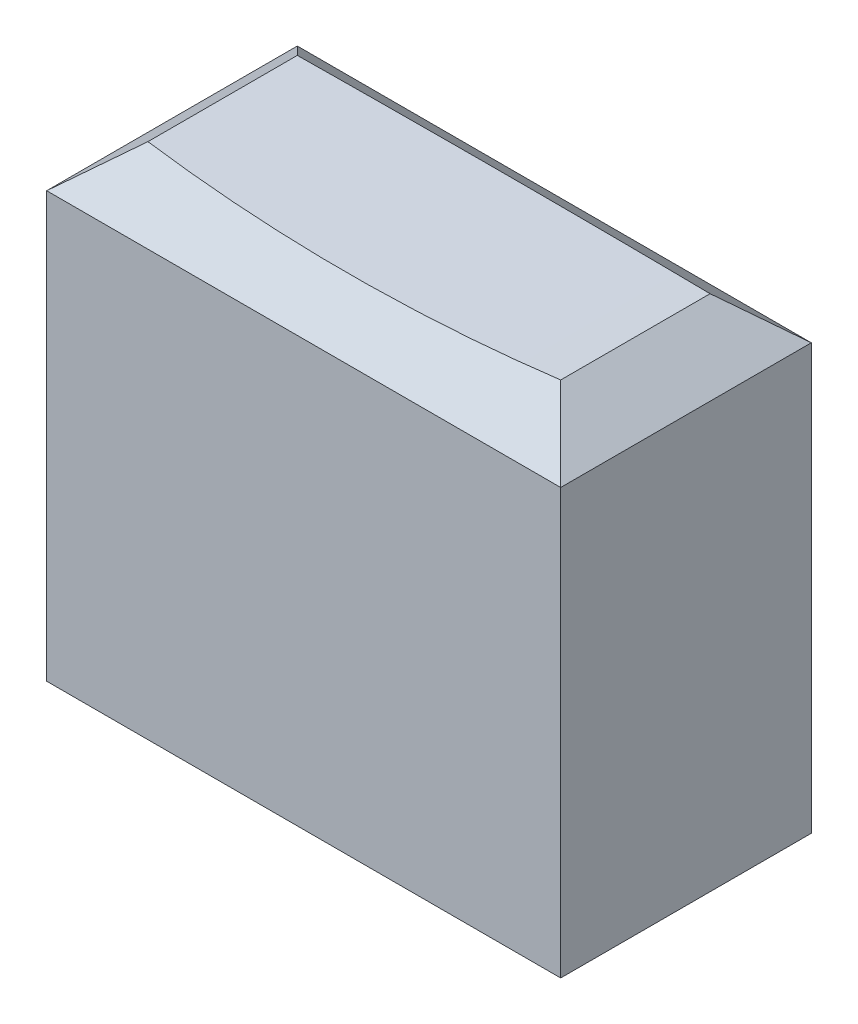
ISO-10303-21;
HEADER;
FILE_DESCRIPTION(('STEP AP214'),'2;1');
FILE_NAME('part.step','',(''),(''),'','','');
FILE_SCHEMA(('AUTOMOTIVE_DESIGN { 1 0 10303 214 1 1 1 1 }'));
ENDSEC;
DATA;
#1=APPLICATION_CONTEXT('core data for automotive mechanical design processes');
#2=APPLICATION_PROTOCOL_DEFINITION('international standard','automotive_design',2000,#1);
#3=PRODUCT_CONTEXT('',#1,'mechanical');
#4=PRODUCT('Part','Part','',(#3));
#5=PRODUCT_RELATED_PRODUCT_CATEGORY('part','',(#4));
#6=PRODUCT_DEFINITION_FORMATION('','',#4);
#7=PRODUCT_DEFINITION_CONTEXT('part definition',#1,'design');
#8=PRODUCT_DEFINITION('design','',#6,#7);
#9=PRODUCT_DEFINITION_SHAPE('','',#8);
#10=(LENGTH_UNIT() NAMED_UNIT(*) SI_UNIT(.MILLI.,.METRE.));
#11=(NAMED_UNIT(*) PLANE_ANGLE_UNIT() SI_UNIT($,.RADIAN.));
#12=(NAMED_UNIT(*) SI_UNIT($,.STERADIAN.) SOLID_ANGLE_UNIT());
#13=UNCERTAINTY_MEASURE_WITH_UNIT(LENGTH_MEASURE(1.E-05),#10,'distance_accuracy_value','');
#14=(GEOMETRIC_REPRESENTATION_CONTEXT(3) GLOBAL_UNCERTAINTY_ASSIGNED_CONTEXT((#13)) GLOBAL_UNIT_ASSIGNED_CONTEXT((#10,
#11,#12)) REPRESENTATION_CONTEXT('',''));
#15=CARTESIAN_POINT('',(0.,0.,0.));
#16=DIRECTION('',(0.,0.,1.));
#17=DIRECTION('',(1.,0.,0.));
#18=AXIS2_PLACEMENT_3D('',#15,#16,#17);
#19=CARTESIAN_POINT('',(-6.05,11.,-2.95));
#20=DIRECTION('',(1.,0.,0.));
#21=DIRECTION('',(0.,0.,-1.));
#22=AXIS2_PLACEMENT_3D('',#19,#20,#21);
#23=PLANE('',#22);
#24=DIRECTION('',(0.,-1.,0.));
#25=VECTOR('',#24,1.);
#26=CARTESIAN_POINT('',(-6.05,11.,2.95));
#27=LINE('',#26,#25);
#28=CARTESIAN_POINT('',(-6.05,10.,2.95));
#29=VERTEX_POINT('',#28);
#30=CARTESIAN_POINT('',(-6.05,0.,2.95));
#31=VERTEX_POINT('',#30);
#32=EDGE_CURVE('E393',#29,#31,#27,.T.);
#33=ORIENTED_EDGE('',*,*,#32,.F.);
#34=DIRECTION('',(0.,0.,-1.));
#35=VECTOR('',#34,1.);
#36=CARTESIAN_POINT('',(-6.05,10.,-2.95));
#37=LINE('',#36,#35);
#38=CARTESIAN_POINT('',(-6.05,10.,-2.95));
#39=VERTEX_POINT('',#38);
#40=EDGE_CURVE('E40',#29,#39,#37,.T.);
#41=ORIENTED_EDGE('',*,*,#40,.T.);
#42=DIRECTION('',(0.,-1.,0.));
#43=VECTOR('',#42,1.);
#44=CARTESIAN_POINT('',(-6.05,11.,-2.95));
#45=LINE('',#44,#43);
#46=CARTESIAN_POINT('',(-6.05,0.,-2.95));
#47=VERTEX_POINT('',#46);
#48=EDGE_CURVE('E387',#39,#47,#45,.T.);
#49=ORIENTED_EDGE('',*,*,#48,.T.);
#50=DIRECTION('',(0.,0.,1.));
#51=VECTOR('',#50,1.);
#52=CARTESIAN_POINT('',(-6.05,0.,-2.95));
#53=LINE('',#52,#51);
#54=EDGE_CURVE('E374',#47,#31,#53,.T.);
#55=ORIENTED_EDGE('',*,*,#54,.T.);
#56=EDGE_LOOP('',(#33,#41,#49,#55));
#57=FACE_BOUND('',#56,.T.);
#58=ADVANCED_FACE('F32',(#57),#23,.F.);
#59=CARTESIAN_POINT('',(-6.05,11.,2.95));
#60=DIRECTION('',(0.,0.,-1.));
#61=DIRECTION('',(-1.,0.,0.));
#62=AXIS2_PLACEMENT_3D('',#59,#60,#61);
#63=PLANE('',#62);
#64=DIRECTION('',(0.,-1.,0.));
#65=VECTOR('',#64,1.);
#66=CARTESIAN_POINT('',(6.05,11.,2.95));
#67=LINE('',#66,#65);
#68=CARTESIAN_POINT('',(6.05,10.,2.95));
#69=VERTEX_POINT('',#68);
#70=CARTESIAN_POINT('',(6.05,0.,2.95));
#71=VERTEX_POINT('',#70);
#72=EDGE_CURVE('E391',#69,#71,#67,.T.);
#73=ORIENTED_EDGE('',*,*,#72,.F.);
#74=DIRECTION('',(-1.,0.,0.));
#75=VECTOR('',#74,1.);
#76=CARTESIAN_POINT('',(-6.05,10.,2.95));
#77=LINE('',#76,#75);
#78=EDGE_CURVE('E55',#69,#29,#77,.T.);
#79=ORIENTED_EDGE('',*,*,#78,.T.);
#80=ORIENTED_EDGE('',*,*,#32,.T.);
#81=DIRECTION('',(1.,0.,0.));
#82=VECTOR('',#81,1.);
#83=CARTESIAN_POINT('',(-6.05,0.,2.95));
#84=LINE('',#83,#82);
#85=EDGE_CURVE('E377',#31,#71,#84,.T.);
#86=ORIENTED_EDGE('',*,*,#85,.T.);
#87=EDGE_LOOP('',(#73,#79,#80,#86));
#88=FACE_BOUND('',#87,.T.);
#89=ADVANCED_FACE('F451',(#88),#63,.F.);
#90=CARTESIAN_POINT('',(6.05,11.,-2.95));
#91=DIRECTION('',(-1.,0.,0.));
#92=DIRECTION('',(0.,0.,1.));
#93=AXIS2_PLACEMENT_3D('',#90,#91,#92);
#94=PLANE('',#93);
#95=DIRECTION('',(0.,-1.,0.));
#96=VECTOR('',#95,1.);
#97=CARTESIAN_POINT('',(6.05,11.,-2.95));
#98=LINE('',#97,#96);
#99=CARTESIAN_POINT('',(6.05,10.,-2.95));
#100=VERTEX_POINT('',#99);
#101=CARTESIAN_POINT('',(6.05,0.,-2.95));
#102=VERTEX_POINT('',#101);
#103=EDGE_CURVE('E389',#100,#102,#98,.T.);
#104=ORIENTED_EDGE('',*,*,#103,.F.);
#105=DIRECTION('',(0.,0.,1.));
#106=VECTOR('',#105,1.);
#107=CARTESIAN_POINT('',(6.05,10.,2.95));
#108=LINE('',#107,#106);
#109=EDGE_CURVE('E402',#100,#69,#108,.T.);
#110=ORIENTED_EDGE('',*,*,#109,.T.);
#111=ORIENTED_EDGE('',*,*,#72,.T.);
#112=DIRECTION('',(0.,0.,-1.));
#113=VECTOR('',#112,1.);
#114=CARTESIAN_POINT('',(6.05,0.,-2.95));
#115=LINE('',#114,#113);
#116=EDGE_CURVE('E381',#71,#102,#115,.T.);
#117=ORIENTED_EDGE('',*,*,#116,.T.);
#118=EDGE_LOOP('',(#104,#110,#111,#117));
#119=FACE_BOUND('',#118,.T.);
#120=ADVANCED_FACE('F456',(#119),#94,.F.);
#121=CARTESIAN_POINT('',(-6.05,11.,-2.95));
#122=DIRECTION('',(0.,0.,1.));
#123=DIRECTION('',(1.,0.,0.));
#124=AXIS2_PLACEMENT_3D('',#121,#122,#123);
#125=PLANE('',#124);
#126=ORIENTED_EDGE('',*,*,#48,.F.);
#127=DIRECTION('',(1.,0.,0.));
#128=VECTOR('',#127,1.);
#129=CARTESIAN_POINT('',(6.05,10.,-2.95));
#130=LINE('',#129,#128);
#131=EDGE_CURVE('E399',#39,#100,#130,.T.);
#132=ORIENTED_EDGE('',*,*,#131,.T.);
#133=ORIENTED_EDGE('',*,*,#103,.T.);
#134=DIRECTION('',(-1.,0.,0.));
#135=VECTOR('',#134,1.);
#136=CARTESIAN_POINT('',(-6.05,0.,-2.95));
#137=LINE('',#136,#135);
#138=EDGE_CURVE('E384',#102,#47,#137,.T.);
#139=ORIENTED_EDGE('',*,*,#138,.T.);
#140=EDGE_LOOP('',(#126,#132,#133,#139));
#141=FACE_BOUND('',#140,.T.);
#142=ADVANCED_FACE('F431',(#141),#125,.F.);
#143=CARTESIAN_POINT('',(0.,0.,0.));
#144=DIRECTION('',(0.,1.,0.));
#145=DIRECTION('',(0.,0.,1.));
#146=AXIS2_PLACEMENT_3D('',#143,#144,#145);
#147=PLANE('',#146);
#148=DIRECTION('',(1.,0.,0.));
#149=VECTOR('',#148,1.);
#150=CARTESIAN_POINT('',(-5.55,0.,-2.45));
#151=LINE('',#150,#149);
#152=CARTESIAN_POINT('',(-5.55,0.,-2.45));
#153=VERTEX_POINT('',#152);
#154=CARTESIAN_POINT('',(-2.05,0.,-2.45));
#155=VERTEX_POINT('',#154);
#156=EDGE_CURVE('E282',#153,#155,#151,.T.);
#157=ORIENTED_EDGE('',*,*,#156,.F.);
#158=DIRECTION('',(0.,0.,-1.));
#159=VECTOR('',#158,1.);
#160=CARTESIAN_POINT('',(-5.55,0.,2.45));
#161=LINE('',#160,#159);
#162=CARTESIAN_POINT('',(-5.55,0.,2.45));
#163=VERTEX_POINT('',#162);
#164=EDGE_CURVE('E47',#163,#153,#161,.T.);
#165=ORIENTED_EDGE('',*,*,#164,.F.);
#166=DIRECTION('',(-1.,0.,0.));
#167=VECTOR('',#166,1.);
#168=CARTESIAN_POINT('',(-5.55,0.,2.45));
#169=LINE('',#168,#167);
#170=CARTESIAN_POINT('',(-2.05,0.,2.45));
#171=VERTEX_POINT('',#170);
#172=EDGE_CURVE('E226',#171,#163,#169,.T.);
#173=ORIENTED_EDGE('',*,*,#172,.F.);
#174=DIRECTION('',(0.,0.,1.));
#175=VECTOR('',#174,1.);
#176=CARTESIAN_POINT('',(-2.05,0.,2.45));
#177=LINE('',#176,#175);
#178=CARTESIAN_POINT('',(-2.05,0.,1.));
#179=VERTEX_POINT('',#178);
#180=EDGE_CURVE('E229',#179,#171,#177,.T.);
#181=ORIENTED_EDGE('',*,*,#180,.F.);
#182=DIRECTION('',(-1.,0.,0.));
#183=VECTOR('',#182,1.);
#184=CARTESIAN_POINT('',(-2.05,0.,1.));
#185=LINE('',#184,#183);
#186=CARTESIAN_POINT('',(-1.65,0.,1.));
#187=VERTEX_POINT('',#186);
#188=EDGE_CURVE('E329',#187,#179,#185,.T.);
#189=ORIENTED_EDGE('',*,*,#188,.F.);
#190=DIRECTION('',(0.,0.,-1.));
#191=VECTOR('',#190,1.);
#192=CARTESIAN_POINT('',(-1.65,0.,1.65));
#193=LINE('',#192,#191);
#194=CARTESIAN_POINT('',(-1.65,0.,1.65));
#195=VERTEX_POINT('',#194);
#196=EDGE_CURVE('E326',#195,#187,#193,.T.);
#197=ORIENTED_EDGE('',*,*,#196,.F.);
#198=DIRECTION('',(-1.,0.,0.));
#199=VECTOR('',#198,1.);
#200=CARTESIAN_POINT('',(-1.65,0.,1.65));
#201=LINE('',#200,#199);
#202=CARTESIAN_POINT('',(1.65,0.,1.65));
#203=VERTEX_POINT('',#202);
#204=EDGE_CURVE('E323',#203,#195,#201,.T.);
#205=ORIENTED_EDGE('',*,*,#204,.F.);
#206=DIRECTION('',(0.,0.,1.));
#207=VECTOR('',#206,1.);
#208=CARTESIAN_POINT('',(1.65,0.,1.65));
#209=LINE('',#208,#207);
#210=CARTESIAN_POINT('',(1.65,0.,1.));
#211=VERTEX_POINT('',#210);
#212=EDGE_CURVE('E320',#211,#203,#209,.T.);
#213=ORIENTED_EDGE('',*,*,#212,.F.);
#214=DIRECTION('',(-1.,0.,0.));
#215=VECTOR('',#214,1.);
#216=CARTESIAN_POINT('',(1.65,0.,1.));
#217=LINE('',#216,#215);
#218=CARTESIAN_POINT('',(2.05,0.,1.));
#219=VERTEX_POINT('',#218);
#220=EDGE_CURVE('E317',#219,#211,#217,.T.);
#221=ORIENTED_EDGE('',*,*,#220,.F.);
#222=DIRECTION('',(0.,0.,-1.));
#223=VECTOR('',#222,1.);
#224=CARTESIAN_POINT('',(2.05,0.,2.45));
#225=LINE('',#224,#223);
#226=CARTESIAN_POINT('',(2.05,0.,2.45));
#227=VERTEX_POINT('',#226);
#228=EDGE_CURVE('E314',#227,#219,#225,.T.);
#229=ORIENTED_EDGE('',*,*,#228,.F.);
#230=DIRECTION('',(-1.,0.,0.));
#231=VECTOR('',#230,1.);
#232=CARTESIAN_POINT('',(2.05,0.,2.45));
#233=LINE('',#232,#231);
#234=CARTESIAN_POINT('',(5.55,0.,2.45));
#235=VERTEX_POINT('',#234);
#236=EDGE_CURVE('E311',#235,#227,#233,.T.);
#237=ORIENTED_EDGE('',*,*,#236,.F.);
#238=DIRECTION('',(0.,0.,1.));
#239=VECTOR('',#238,1.);
#240=CARTESIAN_POINT('',(5.55,0.,2.45));
#241=LINE('',#240,#239);
#242=CARTESIAN_POINT('',(5.55,0.,-2.45));
#243=VERTEX_POINT('',#242);
#244=EDGE_CURVE('E308',#243,#235,#241,.T.);
#245=ORIENTED_EDGE('',*,*,#244,.F.);
#246=DIRECTION('',(1.,0.,0.));
#247=VECTOR('',#246,1.);
#248=CARTESIAN_POINT('',(2.05,0.,-2.45));
#249=LINE('',#248,#247);
#250=CARTESIAN_POINT('',(2.05,0.,-2.45));
#251=VERTEX_POINT('',#250);
#252=EDGE_CURVE('E305',#251,#243,#249,.T.);
#253=ORIENTED_EDGE('',*,*,#252,.F.);
#254=DIRECTION('',(0.,0.,-1.));
#255=VECTOR('',#254,1.);
#256=CARTESIAN_POINT('',(2.05,0.,-1.));
#257=LINE('',#256,#255);
#258=CARTESIAN_POINT('',(2.05,0.,-1.));
#259=VERTEX_POINT('',#258);
#260=EDGE_CURVE('E302',#259,#251,#257,.T.);
#261=ORIENTED_EDGE('',*,*,#260,.F.);
#262=DIRECTION('',(1.,0.,0.));
#263=VECTOR('',#262,1.);
#264=CARTESIAN_POINT('',(1.65,0.,-1.));
#265=LINE('',#264,#263);
#266=CARTESIAN_POINT('',(1.65,0.,-1.));
#267=VERTEX_POINT('',#266);
#268=EDGE_CURVE('E299',#267,#259,#265,.T.);
#269=ORIENTED_EDGE('',*,*,#268,.F.);
#270=DIRECTION('',(0.,0.,1.));
#271=VECTOR('',#270,1.);
#272=CARTESIAN_POINT('',(1.65,0.,-1.));
#273=LINE('',#272,#271);
#274=CARTESIAN_POINT('',(1.65,0.,-1.65));
#275=VERTEX_POINT('',#274);
#276=EDGE_CURVE('E296',#275,#267,#273,.T.);
#277=ORIENTED_EDGE('',*,*,#276,.F.);
#278=DIRECTION('',(1.,0.,0.));
#279=VECTOR('',#278,1.);
#280=CARTESIAN_POINT('',(-1.65,0.,-1.65));
#281=LINE('',#280,#279);
#282=CARTESIAN_POINT('',(-1.65,0.,-1.65));
#283=VERTEX_POINT('',#282);
#284=EDGE_CURVE('E293',#283,#275,#281,.T.);
#285=ORIENTED_EDGE('',*,*,#284,.F.);
#286=DIRECTION('',(0.,0.,-1.));
#287=VECTOR('',#286,1.);
#288=CARTESIAN_POINT('',(-1.65,0.,-1.));
#289=LINE('',#288,#287);
#290=CARTESIAN_POINT('',(-1.65,0.,-1.));
#291=VERTEX_POINT('',#290);
#292=EDGE_CURVE('E290',#291,#283,#289,.T.);
#293=ORIENTED_EDGE('',*,*,#292,.F.);
#294=DIRECTION('',(1.,0.,0.));
#295=VECTOR('',#294,1.);
#296=CARTESIAN_POINT('',(-2.05,0.,-1.));
#297=LINE('',#296,#295);
#298=CARTESIAN_POINT('',(-2.05,0.,-1.));
#299=VERTEX_POINT('',#298);
#300=EDGE_CURVE('E287',#299,#291,#297,.T.);
#301=ORIENTED_EDGE('',*,*,#300,.F.);
#302=DIRECTION('',(0.,0.,1.));
#303=VECTOR('',#302,1.);
#304=CARTESIAN_POINT('',(-2.05,0.,-1.));
#305=LINE('',#304,#303);
#306=EDGE_CURVE('E284',#155,#299,#305,.T.);
#307=ORIENTED_EDGE('',*,*,#306,.F.);
#308=EDGE_LOOP('',(#157,#165,#173,#181,#189,#197,#205,#213,#221,#229,#237,#245,#253,#261,#269,
#277,#285,#293,#301,#307));
#309=FACE_BOUND('',#308,.T.);
#310=ORIENTED_EDGE('',*,*,#54,.F.);
#311=ORIENTED_EDGE('',*,*,#138,.F.);
#312=ORIENTED_EDGE('',*,*,#116,.F.);
#313=ORIENTED_EDGE('',*,*,#85,.F.);
#314=EDGE_LOOP('',(#310,#311,#312,#313));
#315=FACE_BOUND('',#314,.T.);
#316=ADVANCED_FACE('F465',(#309,#315),#147,.F.);
#317=CARTESIAN_POINT('',(0.,11.,1.75824640740579));
#318=DIRECTION('',(0.,0.766044443118976,0.642787609686541));
#319=DIRECTION('',(-1.,0.,0.));
#320=AXIS2_PLACEMENT_3D('',#317,#318,#319);
#321=PLANE('',#320);
#322=CARTESIAN_POINT('',(0.,89.6001938502372,-91.9138169922152));
#323=DIRECTION('',(0.,0.766044443118976,0.642787609686541));
#324=DIRECTION('',(0.,-0.642787609686541,0.766044443118976));
#325=AXIS2_PLACEMENT_3D('',#322,#323,#324);
#326=ELLIPSE('',#325,122.51355294269,78.7501938502372);
#327=CARTESIAN_POINT('',(-4.85824640740579,11.,1.7582464074058));
#328=VERTEX_POINT('',#327);
#329=CARTESIAN_POINT('',(4.85824640740579,11.,1.7582464074058));
#330=VERTEX_POINT('',#329);
#331=EDGE_CURVE('E336',#328,#330,#326,.T.);
#332=ORIENTED_EDGE('',*,*,#331,.F.);
#333=DIRECTION('',(0.608120402411342,0.510273605374739,-0.608120402411342));
#334=VECTOR('',#333,1.);
#335=CARTESIAN_POINT('',(-4.20802855828736,11.5455975573802,1.10802855828736));
#336=LINE('',#335,#334);
#337=EDGE_CURVE('E410',#29,#328,#336,.T.);
#338=ORIENTED_EDGE('',*,*,#337,.F.);
#339=ORIENTED_EDGE('',*,*,#78,.F.);
#340=DIRECTION('',(-0.608120402411342,0.510273605374739,-0.608120402411342));
#341=VECTOR('',#340,1.);
#342=CARTESIAN_POINT('',(3.06161624441767,12.5075517071253,-0.038383755582331));
#343=LINE('',#342,#341);
#344=EDGE_CURVE('E378',#330,#69,#343,.F.);
#345=ORIENTED_EDGE('',*,*,#344,.F.);
#346=EDGE_LOOP('',(#332,#338,#339,#345));
#347=FACE_BOUND('',#346,.T.);
#348=ADVANCED_FACE('F34',(#347),#321,.T.);
#349=CARTESIAN_POINT('',(4.85824640740579,11.,0.));
#350=DIRECTION('',(0.642787609686541,0.766044443118976,0.));
#351=DIRECTION('',(0.,0.,1.));
#352=AXIS2_PLACEMENT_3D('',#349,#350,#351);
#353=PLANE('',#352);
#354=ORIENTED_EDGE('',*,*,#344,.T.);
#355=ORIENTED_EDGE('',*,*,#109,.F.);
#356=DIRECTION('',(-0.608120402411342,0.510273605374739,0.608120402411342));
#357=VECTOR('',#356,1.);
#358=CARTESIAN_POINT('',(4.20802855828736,11.5455975573802,-1.10802855828736));
#359=LINE('',#358,#357);
#360=CARTESIAN_POINT('',(4.85824640740579,11.,-1.75824640740579));
#361=VERTEX_POINT('',#360);
#362=EDGE_CURVE('E408',#361,#100,#359,.F.);
#363=ORIENTED_EDGE('',*,*,#362,.F.);
#364=DIRECTION('',(0.,0.,-1.));
#365=VECTOR('',#364,1.);
#366=CARTESIAN_POINT('',(4.85824640740579,11.,-2.95));
#367=LINE('',#366,#365);
#368=EDGE_CURVE('E397',#330,#361,#367,.T.);
#369=ORIENTED_EDGE('',*,*,#368,.F.);
#370=EDGE_LOOP('',(#354,#355,#363,#369));
#371=FACE_BOUND('',#370,.T.);
#372=ADVANCED_FACE('F417',(#371),#353,.T.);
#373=CARTESIAN_POINT('',(-4.85824640740579,11.,0.));
#374=DIRECTION('',(-0.642787609686541,0.766044443118976,0.));
#375=DIRECTION('',(0.,0.,-1.));
#376=AXIS2_PLACEMENT_3D('',#373,#374,#375);
#377=PLANE('',#376);
#378=ORIENTED_EDGE('',*,*,#337,.T.);
#379=DIRECTION('',(0.,0.,1.));
#380=VECTOR('',#379,1.);
#381=CARTESIAN_POINT('',(-4.85824640740579,11.,2.95));
#382=LINE('',#381,#380);
#383=CARTESIAN_POINT('',(-4.85824640740579,11.,-1.75824640740579));
#384=VERTEX_POINT('',#383);
#385=EDGE_CURVE('E395',#384,#328,#382,.T.);
#386=ORIENTED_EDGE('',*,*,#385,.F.);
#387=DIRECTION('',(-0.608120402411342,-0.510273605374739,-0.608120402411342));
#388=VECTOR('',#387,1.);
#389=CARTESIAN_POINT('',(-4.20802855828736,11.5455975573802,-1.10802855828736));
#390=LINE('',#389,#388);
#391=EDGE_CURVE('E373',#39,#384,#390,.F.);
#392=ORIENTED_EDGE('',*,*,#391,.F.);
#393=ORIENTED_EDGE('',*,*,#40,.F.);
#394=EDGE_LOOP('',(#378,#386,#392,#393));
#395=FACE_BOUND('',#394,.T.);
#396=ADVANCED_FACE('F426',(#395),#377,.T.);
#397=CARTESIAN_POINT('',(0.,11.,-1.75824640740579));
#398=DIRECTION('',(0.,0.766044443118976,-0.642787609686541));
#399=DIRECTION('',(1.,0.,0.));
#400=AXIS2_PLACEMENT_3D('',#397,#398,#399);
#401=PLANE('',#400);
#402=CARTESIAN_POINT('',(0.,89.6001938502372,91.9138169922152));
#403=DIRECTION('',(0.,0.766044443118976,-0.642787609686541));
#404=DIRECTION('',(0.,0.642787609686541,0.766044443118976));
#405=AXIS2_PLACEMENT_3D('',#402,#403,#404);
#406=ELLIPSE('',#405,122.51355294269,78.7501938502372);
#407=EDGE_CURVE('E11',#361,#384,#406,.T.);
#408=ORIENTED_EDGE('',*,*,#407,.F.);
#409=ORIENTED_EDGE('',*,*,#362,.T.);
#410=ORIENTED_EDGE('',*,*,#131,.F.);
#411=ORIENTED_EDGE('',*,*,#391,.T.);
#412=EDGE_LOOP('',(#408,#409,#410,#411));
#413=FACE_BOUND('',#412,.T.);
#414=ADVANCED_FACE('F437',(#413),#401,.T.);
#415=CARTESIAN_POINT('',(0.,89.6001938502372,-2.95));
#416=DIRECTION('',(0.,0.,1.));
#417=DIRECTION('',(1.,0.,0.));
#418=AXIS2_PLACEMENT_3D('',#415,#416,#417);
#419=CYLINDRICAL_SURFACE('',#418,78.7501938502372);
#420=ORIENTED_EDGE('',*,*,#331,.T.);
#421=ORIENTED_EDGE('',*,*,#368,.T.);
#422=ORIENTED_EDGE('',*,*,#407,.T.);
#423=ORIENTED_EDGE('',*,*,#385,.T.);
#424=EDGE_LOOP('',(#420,#421,#422,#423));
#425=FACE_BOUND('',#424,.T.);
#426=ADVANCED_FACE('F439',(#425),#419,.F.);
#427=CARTESIAN_POINT('',(-5.55,9.,2.45));
#428=DIRECTION('',(-1.,0.,0.));
#429=DIRECTION('',(0.,0.,1.));
#430=AXIS2_PLACEMENT_3D('',#427,#428,#429);
#431=PLANE('',#430);
#432=ORIENTED_EDGE('',*,*,#164,.T.);
#433=DIRECTION('',(0.,-1.,0.));
#434=VECTOR('',#433,1.);
#435=CARTESIAN_POINT('',(-5.55,9.,-2.45));
#436=LINE('',#435,#434);
#437=CARTESIAN_POINT('',(-5.55,9.,-2.45));
#438=VERTEX_POINT('',#437);
#439=EDGE_CURVE('E203',#438,#153,#436,.T.);
#440=ORIENTED_EDGE('',*,*,#439,.F.);
#441=DIRECTION('',(0.,0.,-1.));
#442=VECTOR('',#441,1.);
#443=CARTESIAN_POINT('',(-5.55,9.,2.45));
#444=LINE('',#443,#442);
#445=CARTESIAN_POINT('',(-5.55,9.,2.45));
#446=VERTEX_POINT('',#445);
#447=EDGE_CURVE('E207',#446,#438,#444,.T.);
#448=ORIENTED_EDGE('',*,*,#447,.F.);
#449=DIRECTION('',(0.,-1.,0.));
#450=VECTOR('',#449,1.);
#451=CARTESIAN_POINT('',(-5.55,9.,2.45));
#452=LINE('',#451,#450);
#453=EDGE_CURVE('E334',#446,#163,#452,.T.);
#454=ORIENTED_EDGE('',*,*,#453,.T.);
#455=EDGE_LOOP('',(#432,#440,#448,#454));
#456=FACE_BOUND('',#455,.T.);
#457=ADVANCED_FACE('F205',(#456),#431,.F.);
#458=CARTESIAN_POINT('',(-5.55,9.,2.45));
#459=DIRECTION('',(0.,0.,1.));
#460=DIRECTION('',(1.,0.,0.));
#461=AXIS2_PLACEMENT_3D('',#458,#459,#460);
#462=PLANE('',#461);
#463=ORIENTED_EDGE('',*,*,#172,.T.);
#464=ORIENTED_EDGE('',*,*,#453,.F.);
#465=DIRECTION('',(-1.,0.,0.));
#466=VECTOR('',#465,1.);
#467=CARTESIAN_POINT('',(-5.55,9.,2.45));
#468=LINE('',#467,#466);
#469=CARTESIAN_POINT('',(-2.05,9.,2.45));
#470=VERTEX_POINT('',#469);
#471=EDGE_CURVE('E213',#470,#446,#468,.T.);
#472=ORIENTED_EDGE('',*,*,#471,.F.);
#473=DIRECTION('',(0.,-1.,0.));
#474=VECTOR('',#473,1.);
#475=CARTESIAN_POINT('',(-2.05,9.,2.45));
#476=LINE('',#475,#474);
#477=EDGE_CURVE('E337',#470,#171,#476,.T.);
#478=ORIENTED_EDGE('',*,*,#477,.T.);
#479=EDGE_LOOP('',(#463,#464,#472,#478));
#480=FACE_BOUND('',#479,.T.);
#481=ADVANCED_FACE('F446',(#480),#462,.F.);
#482=CARTESIAN_POINT('',(-2.05,9.,2.45));
#483=DIRECTION('',(1.,0.,0.));
#484=DIRECTION('',(0.,0.,-1.));
#485=AXIS2_PLACEMENT_3D('',#482,#483,#484);
#486=PLANE('',#485);
#487=ORIENTED_EDGE('',*,*,#180,.T.);
#488=ORIENTED_EDGE('',*,*,#477,.F.);
#489=DIRECTION('',(0.,0.,1.));
#490=VECTOR('',#489,1.);
#491=CARTESIAN_POINT('',(-2.05,9.,2.45));
#492=LINE('',#491,#490);
#493=CARTESIAN_POINT('',(-2.05,9.,1.));
#494=VERTEX_POINT('',#493);
#495=EDGE_CURVE('E278',#494,#470,#492,.T.);
#496=ORIENTED_EDGE('',*,*,#495,.F.);
#497=DIRECTION('',(0.,-1.,0.));
#498=VECTOR('',#497,1.);
#499=CARTESIAN_POINT('',(-2.05,9.,1.));
#500=LINE('',#499,#498);
#501=EDGE_CURVE('E339',#494,#179,#500,.T.);
#502=ORIENTED_EDGE('',*,*,#501,.T.);
#503=EDGE_LOOP('',(#487,#488,#496,#502));
#504=FACE_BOUND('',#503,.T.);
#505=ADVANCED_FACE('F530',(#504),#486,.F.);
#506=CARTESIAN_POINT('',(-2.05,9.,1.));
#507=DIRECTION('',(0.,0.,1.));
#508=DIRECTION('',(1.,0.,0.));
#509=AXIS2_PLACEMENT_3D('',#506,#507,#508);
#510=PLANE('',#509);
#511=ORIENTED_EDGE('',*,*,#188,.T.);
#512=ORIENTED_EDGE('',*,*,#501,.F.);
#513=DIRECTION('',(-1.,0.,0.));
#514=VECTOR('',#513,1.);
#515=CARTESIAN_POINT('',(-2.05,9.,1.));
#516=LINE('',#515,#514);
#517=CARTESIAN_POINT('',(-1.65,9.,1.));
#518=VERTEX_POINT('',#517);
#519=EDGE_CURVE('E275',#518,#494,#516,.T.);
#520=ORIENTED_EDGE('',*,*,#519,.F.);
#521=DIRECTION('',(0.,-1.,0.));
#522=VECTOR('',#521,1.);
#523=CARTESIAN_POINT('',(-1.65,9.,1.));
#524=LINE('',#523,#522);
#525=EDGE_CURVE('E341',#518,#187,#524,.T.);
#526=ORIENTED_EDGE('',*,*,#525,.T.);
#527=EDGE_LOOP('',(#511,#512,#520,#526));
#528=FACE_BOUND('',#527,.T.);
#529=ADVANCED_FACE('F540',(#528),#510,.F.);
#530=CARTESIAN_POINT('',(-1.65,9.,1.65));
#531=DIRECTION('',(-1.,0.,0.));
#532=DIRECTION('',(0.,0.,1.));
#533=AXIS2_PLACEMENT_3D('',#530,#531,#532);
#534=PLANE('',#533);
#535=ORIENTED_EDGE('',*,*,#196,.T.);
#536=ORIENTED_EDGE('',*,*,#525,.F.);
#537=DIRECTION('',(0.,0.,-1.));
#538=VECTOR('',#537,1.);
#539=CARTESIAN_POINT('',(-1.65,9.,1.65));
#540=LINE('',#539,#538);
#541=CARTESIAN_POINT('',(-1.65,9.,1.65));
#542=VERTEX_POINT('',#541);
#543=EDGE_CURVE('E272',#542,#518,#540,.T.);
#544=ORIENTED_EDGE('',*,*,#543,.F.);
#545=DIRECTION('',(0.,-1.,0.));
#546=VECTOR('',#545,1.);
#547=CARTESIAN_POINT('',(-1.65,9.,1.65));
#548=LINE('',#547,#546);
#549=EDGE_CURVE('E343',#542,#195,#548,.T.);
#550=ORIENTED_EDGE('',*,*,#549,.T.);
#551=EDGE_LOOP('',(#535,#536,#544,#550));
#552=FACE_BOUND('',#551,.T.);
#553=ADVANCED_FACE('F550',(#552),#534,.F.);
#554=CARTESIAN_POINT('',(-1.65,9.,1.65));
#555=DIRECTION('',(0.,0.,1.));
#556=DIRECTION('',(1.,0.,0.));
#557=AXIS2_PLACEMENT_3D('',#554,#555,#556);
#558=PLANE('',#557);
#559=ORIENTED_EDGE('',*,*,#204,.T.);
#560=ORIENTED_EDGE('',*,*,#549,.F.);
#561=DIRECTION('',(-1.,0.,0.));
#562=VECTOR('',#561,1.);
#563=CARTESIAN_POINT('',(-1.65,9.,1.65));
#564=LINE('',#563,#562);
#565=CARTESIAN_POINT('',(1.65,9.,1.65));
#566=VERTEX_POINT('',#565);
#567=EDGE_CURVE('E269',#566,#542,#564,.T.);
#568=ORIENTED_EDGE('',*,*,#567,.F.);
#569=DIRECTION('',(0.,-1.,0.));
#570=VECTOR('',#569,1.);
#571=CARTESIAN_POINT('',(1.65,9.,1.65));
#572=LINE('',#571,#570);
#573=EDGE_CURVE('E345',#566,#203,#572,.T.);
#574=ORIENTED_EDGE('',*,*,#573,.T.);
#575=EDGE_LOOP('',(#559,#560,#568,#574));
#576=FACE_BOUND('',#575,.T.);
#577=ADVANCED_FACE('F560',(#576),#558,.F.);
#578=CARTESIAN_POINT('',(1.65,9.,1.65));
#579=DIRECTION('',(1.,0.,0.));
#580=DIRECTION('',(0.,0.,-1.));
#581=AXIS2_PLACEMENT_3D('',#578,#579,#580);
#582=PLANE('',#581);
#583=ORIENTED_EDGE('',*,*,#212,.T.);
#584=ORIENTED_EDGE('',*,*,#573,.F.);
#585=DIRECTION('',(0.,0.,1.));
#586=VECTOR('',#585,1.);
#587=CARTESIAN_POINT('',(1.65,9.,1.65));
#588=LINE('',#587,#586);
#589=CARTESIAN_POINT('',(1.65,9.,1.));
#590=VERTEX_POINT('',#589);
#591=EDGE_CURVE('E266',#590,#566,#588,.T.);
#592=ORIENTED_EDGE('',*,*,#591,.F.);
#593=DIRECTION('',(0.,-1.,0.));
#594=VECTOR('',#593,1.);
#595=CARTESIAN_POINT('',(1.65,9.,1.));
#596=LINE('',#595,#594);
#597=EDGE_CURVE('E347',#590,#211,#596,.T.);
#598=ORIENTED_EDGE('',*,*,#597,.T.);
#599=EDGE_LOOP('',(#583,#584,#592,#598));
#600=FACE_BOUND('',#599,.T.);
#601=ADVANCED_FACE('F570',(#600),#582,.F.);
#602=CARTESIAN_POINT('',(1.65,9.,1.));
#603=DIRECTION('',(0.,0.,1.));
#604=DIRECTION('',(1.,0.,0.));
#605=AXIS2_PLACEMENT_3D('',#602,#603,#604);
#606=PLANE('',#605);
#607=ORIENTED_EDGE('',*,*,#220,.T.);
#608=ORIENTED_EDGE('',*,*,#597,.F.);
#609=DIRECTION('',(-1.,0.,0.));
#610=VECTOR('',#609,1.);
#611=CARTESIAN_POINT('',(1.65,9.,1.));
#612=LINE('',#611,#610);
#613=CARTESIAN_POINT('',(2.05,9.,1.));
#614=VERTEX_POINT('',#613);
#615=EDGE_CURVE('E263',#614,#590,#612,.T.);
#616=ORIENTED_EDGE('',*,*,#615,.F.);
#617=DIRECTION('',(0.,-1.,0.));
#618=VECTOR('',#617,1.);
#619=CARTESIAN_POINT('',(2.05,9.,1.));
#620=LINE('',#619,#618);
#621=EDGE_CURVE('E349',#614,#219,#620,.T.);
#622=ORIENTED_EDGE('',*,*,#621,.T.);
#623=EDGE_LOOP('',(#607,#608,#616,#622));
#624=FACE_BOUND('',#623,.T.);
#625=ADVANCED_FACE('F580',(#624),#606,.F.);
#626=CARTESIAN_POINT('',(2.05,9.,2.45));
#627=DIRECTION('',(-1.,0.,0.));
#628=DIRECTION('',(0.,0.,1.));
#629=AXIS2_PLACEMENT_3D('',#626,#627,#628);
#630=PLANE('',#629);
#631=ORIENTED_EDGE('',*,*,#228,.T.);
#632=ORIENTED_EDGE('',*,*,#621,.F.);
#633=DIRECTION('',(0.,0.,-1.));
#634=VECTOR('',#633,1.);
#635=CARTESIAN_POINT('',(2.05,9.,2.45));
#636=LINE('',#635,#634);
#637=CARTESIAN_POINT('',(2.05,9.,2.45));
#638=VERTEX_POINT('',#637);
#639=EDGE_CURVE('E260',#638,#614,#636,.T.);
#640=ORIENTED_EDGE('',*,*,#639,.F.);
#641=DIRECTION('',(0.,-1.,0.));
#642=VECTOR('',#641,1.);
#643=CARTESIAN_POINT('',(2.05,9.,2.45));
#644=LINE('',#643,#642);
#645=EDGE_CURVE('E351',#638,#227,#644,.T.);
#646=ORIENTED_EDGE('',*,*,#645,.T.);
#647=EDGE_LOOP('',(#631,#632,#640,#646));
#648=FACE_BOUND('',#647,.T.);
#649=ADVANCED_FACE('F590',(#648),#630,.F.);
#650=CARTESIAN_POINT('',(2.05,9.,2.45));
#651=DIRECTION('',(0.,0.,1.));
#652=DIRECTION('',(1.,0.,0.));
#653=AXIS2_PLACEMENT_3D('',#650,#651,#652);
#654=PLANE('',#653);
#655=ORIENTED_EDGE('',*,*,#236,.T.);
#656=ORIENTED_EDGE('',*,*,#645,.F.);
#657=DIRECTION('',(-1.,0.,0.));
#658=VECTOR('',#657,1.);
#659=CARTESIAN_POINT('',(2.05,9.,2.45));
#660=LINE('',#659,#658);
#661=CARTESIAN_POINT('',(5.55,9.,2.45));
#662=VERTEX_POINT('',#661);
#663=EDGE_CURVE('E257',#662,#638,#660,.T.);
#664=ORIENTED_EDGE('',*,*,#663,.F.);
#665=DIRECTION('',(0.,-1.,0.));
#666=VECTOR('',#665,1.);
#667=CARTESIAN_POINT('',(5.55,9.,2.45));
#668=LINE('',#667,#666);
#669=EDGE_CURVE('E353',#662,#235,#668,.T.);
#670=ORIENTED_EDGE('',*,*,#669,.T.);
#671=EDGE_LOOP('',(#655,#656,#664,#670));
#672=FACE_BOUND('',#671,.T.);
#673=ADVANCED_FACE('F600',(#672),#654,.F.);
#674=CARTESIAN_POINT('',(5.55,9.,2.45));
#675=DIRECTION('',(1.,0.,0.));
#676=DIRECTION('',(0.,0.,-1.));
#677=AXIS2_PLACEMENT_3D('',#674,#675,#676);
#678=PLANE('',#677);
#679=ORIENTED_EDGE('',*,*,#244,.T.);
#680=ORIENTED_EDGE('',*,*,#669,.F.);
#681=DIRECTION('',(0.,0.,1.));
#682=VECTOR('',#681,1.);
#683=CARTESIAN_POINT('',(5.55,9.,2.45));
#684=LINE('',#683,#682);
#685=CARTESIAN_POINT('',(5.55,9.,-2.45));
#686=VERTEX_POINT('',#685);
#687=EDGE_CURVE('E254',#686,#662,#684,.T.);
#688=ORIENTED_EDGE('',*,*,#687,.F.);
#689=DIRECTION('',(0.,-1.,0.));
#690=VECTOR('',#689,1.);
#691=CARTESIAN_POINT('',(5.55,9.,-2.45));
#692=LINE('',#691,#690);
#693=EDGE_CURVE('E355',#686,#243,#692,.T.);
#694=ORIENTED_EDGE('',*,*,#693,.T.);
#695=EDGE_LOOP('',(#679,#680,#688,#694));
#696=FACE_BOUND('',#695,.T.);
#697=ADVANCED_FACE('F610',(#696),#678,.F.);
#698=CARTESIAN_POINT('',(2.05,9.,-2.45));
#699=DIRECTION('',(0.,0.,-1.));
#700=DIRECTION('',(-1.,0.,0.));
#701=AXIS2_PLACEMENT_3D('',#698,#699,#700);
#702=PLANE('',#701);
#703=ORIENTED_EDGE('',*,*,#252,.T.);
#704=ORIENTED_EDGE('',*,*,#693,.F.);
#705=DIRECTION('',(1.,0.,0.));
#706=VECTOR('',#705,1.);
#707=CARTESIAN_POINT('',(2.05,9.,-2.45));
#708=LINE('',#707,#706);
#709=CARTESIAN_POINT('',(2.05,9.,-2.45));
#710=VERTEX_POINT('',#709);
#711=EDGE_CURVE('E251',#710,#686,#708,.T.);
#712=ORIENTED_EDGE('',*,*,#711,.F.);
#713=DIRECTION('',(0.,-1.,0.));
#714=VECTOR('',#713,1.);
#715=CARTESIAN_POINT('',(2.05,9.,-2.45));
#716=LINE('',#715,#714);
#717=EDGE_CURVE('E357',#710,#251,#716,.T.);
#718=ORIENTED_EDGE('',*,*,#717,.T.);
#719=EDGE_LOOP('',(#703,#704,#712,#718));
#720=FACE_BOUND('',#719,.T.);
#721=ADVANCED_FACE('F620',(#720),#702,.F.);
#722=CARTESIAN_POINT('',(2.05,9.,-1.));
#723=DIRECTION('',(-1.,0.,0.));
#724=DIRECTION('',(0.,0.,1.));
#725=AXIS2_PLACEMENT_3D('',#722,#723,#724);
#726=PLANE('',#725);
#727=ORIENTED_EDGE('',*,*,#260,.T.);
#728=ORIENTED_EDGE('',*,*,#717,.F.);
#729=DIRECTION('',(0.,0.,-1.));
#730=VECTOR('',#729,1.);
#731=CARTESIAN_POINT('',(2.05,9.,-1.));
#732=LINE('',#731,#730);
#733=CARTESIAN_POINT('',(2.05,9.,-1.));
#734=VERTEX_POINT('',#733);
#735=EDGE_CURVE('E248',#734,#710,#732,.T.);
#736=ORIENTED_EDGE('',*,*,#735,.F.);
#737=DIRECTION('',(0.,-1.,0.));
#738=VECTOR('',#737,1.);
#739=CARTESIAN_POINT('',(2.05,9.,-1.));
#740=LINE('',#739,#738);
#741=EDGE_CURVE('E359',#734,#259,#740,.T.);
#742=ORIENTED_EDGE('',*,*,#741,.T.);
#743=EDGE_LOOP('',(#727,#728,#736,#742));
#744=FACE_BOUND('',#743,.T.);
#745=ADVANCED_FACE('F630',(#744),#726,.F.);
#746=CARTESIAN_POINT('',(1.65,9.,-1.));
#747=DIRECTION('',(0.,0.,-1.));
#748=DIRECTION('',(-1.,0.,0.));
#749=AXIS2_PLACEMENT_3D('',#746,#747,#748);
#750=PLANE('',#749);
#751=ORIENTED_EDGE('',*,*,#268,.T.);
#752=ORIENTED_EDGE('',*,*,#741,.F.);
#753=DIRECTION('',(1.,0.,0.));
#754=VECTOR('',#753,1.);
#755=CARTESIAN_POINT('',(1.65,9.,-1.));
#756=LINE('',#755,#754);
#757=CARTESIAN_POINT('',(1.65,9.,-1.));
#758=VERTEX_POINT('',#757);
#759=EDGE_CURVE('E245',#758,#734,#756,.T.);
#760=ORIENTED_EDGE('',*,*,#759,.F.);
#761=DIRECTION('',(0.,-1.,0.));
#762=VECTOR('',#761,1.);
#763=CARTESIAN_POINT('',(1.65,9.,-1.));
#764=LINE('',#763,#762);
#765=EDGE_CURVE('E361',#758,#267,#764,.T.);
#766=ORIENTED_EDGE('',*,*,#765,.T.);
#767=EDGE_LOOP('',(#751,#752,#760,#766));
#768=FACE_BOUND('',#767,.T.);
#769=ADVANCED_FACE('F640',(#768),#750,.F.);
#770=CARTESIAN_POINT('',(1.65,9.,-1.));
#771=DIRECTION('',(1.,0.,0.));
#772=DIRECTION('',(0.,0.,-1.));
#773=AXIS2_PLACEMENT_3D('',#770,#771,#772);
#774=PLANE('',#773);
#775=ORIENTED_EDGE('',*,*,#276,.T.);
#776=ORIENTED_EDGE('',*,*,#765,.F.);
#777=DIRECTION('',(0.,0.,1.));
#778=VECTOR('',#777,1.);
#779=CARTESIAN_POINT('',(1.65,9.,-1.));
#780=LINE('',#779,#778);
#781=CARTESIAN_POINT('',(1.65,9.,-1.65));
#782=VERTEX_POINT('',#781);
#783=EDGE_CURVE('E242',#782,#758,#780,.T.);
#784=ORIENTED_EDGE('',*,*,#783,.F.);
#785=DIRECTION('',(0.,-1.,0.));
#786=VECTOR('',#785,1.);
#787=CARTESIAN_POINT('',(1.65,9.,-1.65));
#788=LINE('',#787,#786);
#789=EDGE_CURVE('E363',#782,#275,#788,.T.);
#790=ORIENTED_EDGE('',*,*,#789,.T.);
#791=EDGE_LOOP('',(#775,#776,#784,#790));
#792=FACE_BOUND('',#791,.T.);
#793=ADVANCED_FACE('F650',(#792),#774,.F.);
#794=CARTESIAN_POINT('',(-1.65,9.,-1.65));
#795=DIRECTION('',(0.,0.,-1.));
#796=DIRECTION('',(-1.,0.,0.));
#797=AXIS2_PLACEMENT_3D('',#794,#795,#796);
#798=PLANE('',#797);
#799=ORIENTED_EDGE('',*,*,#284,.T.);
#800=ORIENTED_EDGE('',*,*,#789,.F.);
#801=DIRECTION('',(1.,0.,0.));
#802=VECTOR('',#801,1.);
#803=CARTESIAN_POINT('',(-1.65,9.,-1.65));
#804=LINE('',#803,#802);
#805=CARTESIAN_POINT('',(-1.65,9.,-1.65));
#806=VERTEX_POINT('',#805);
#807=EDGE_CURVE('E239',#806,#782,#804,.T.);
#808=ORIENTED_EDGE('',*,*,#807,.F.);
#809=DIRECTION('',(0.,-1.,0.));
#810=VECTOR('',#809,1.);
#811=CARTESIAN_POINT('',(-1.65,9.,-1.65));
#812=LINE('',#811,#810);
#813=EDGE_CURVE('E365',#806,#283,#812,.T.);
#814=ORIENTED_EDGE('',*,*,#813,.T.);
#815=EDGE_LOOP('',(#799,#800,#808,#814));
#816=FACE_BOUND('',#815,.T.);
#817=ADVANCED_FACE('F660',(#816),#798,.F.);
#818=CARTESIAN_POINT('',(-1.65,9.,-1.));
#819=DIRECTION('',(-1.,0.,0.));
#820=DIRECTION('',(0.,0.,1.));
#821=AXIS2_PLACEMENT_3D('',#818,#819,#820);
#822=PLANE('',#821);
#823=ORIENTED_EDGE('',*,*,#292,.T.);
#824=ORIENTED_EDGE('',*,*,#813,.F.);
#825=DIRECTION('',(0.,0.,-1.));
#826=VECTOR('',#825,1.);
#827=CARTESIAN_POINT('',(-1.65,9.,-1.));
#828=LINE('',#827,#826);
#829=CARTESIAN_POINT('',(-1.65,9.,-1.));
#830=VERTEX_POINT('',#829);
#831=EDGE_CURVE('E236',#830,#806,#828,.T.);
#832=ORIENTED_EDGE('',*,*,#831,.F.);
#833=DIRECTION('',(0.,-1.,0.));
#834=VECTOR('',#833,1.);
#835=CARTESIAN_POINT('',(-1.65,9.,-1.));
#836=LINE('',#835,#834);
#837=EDGE_CURVE('E367',#830,#291,#836,.T.);
#838=ORIENTED_EDGE('',*,*,#837,.T.);
#839=EDGE_LOOP('',(#823,#824,#832,#838));
#840=FACE_BOUND('',#839,.T.);
#841=ADVANCED_FACE('F670',(#840),#822,.F.);
#842=CARTESIAN_POINT('',(-2.05,9.,-1.));
#843=DIRECTION('',(0.,0.,-1.));
#844=DIRECTION('',(-1.,0.,0.));
#845=AXIS2_PLACEMENT_3D('',#842,#843,#844);
#846=PLANE('',#845);
#847=ORIENTED_EDGE('',*,*,#300,.T.);
#848=ORIENTED_EDGE('',*,*,#837,.F.);
#849=DIRECTION('',(1.,0.,0.));
#850=VECTOR('',#849,1.);
#851=CARTESIAN_POINT('',(-2.05,9.,-1.));
#852=LINE('',#851,#850);
#853=CARTESIAN_POINT('',(-2.05,9.,-1.));
#854=VERTEX_POINT('',#853);
#855=EDGE_CURVE('E233',#854,#830,#852,.T.);
#856=ORIENTED_EDGE('',*,*,#855,.F.);
#857=DIRECTION('',(0.,-1.,0.));
#858=VECTOR('',#857,1.);
#859=CARTESIAN_POINT('',(-2.05,9.,-1.));
#860=LINE('',#859,#858);
#861=EDGE_CURVE('E369',#854,#299,#860,.T.);
#862=ORIENTED_EDGE('',*,*,#861,.T.);
#863=EDGE_LOOP('',(#847,#848,#856,#862));
#864=FACE_BOUND('',#863,.T.);
#865=ADVANCED_FACE('F680',(#864),#846,.F.);
#866=CARTESIAN_POINT('',(-2.05,9.,-1.));
#867=DIRECTION('',(1.,0.,0.));
#868=DIRECTION('',(0.,0.,-1.));
#869=AXIS2_PLACEMENT_3D('',#866,#867,#868);
#870=PLANE('',#869);
#871=ORIENTED_EDGE('',*,*,#306,.T.);
#872=ORIENTED_EDGE('',*,*,#861,.F.);
#873=DIRECTION('',(0.,0.,1.));
#874=VECTOR('',#873,1.);
#875=CARTESIAN_POINT('',(-2.05,9.,-1.));
#876=LINE('',#875,#874);
#877=CARTESIAN_POINT('',(-2.05,9.,-2.45));
#878=VERTEX_POINT('',#877);
#879=EDGE_CURVE('E221',#878,#854,#876,.T.);
#880=ORIENTED_EDGE('',*,*,#879,.F.);
#881=DIRECTION('',(0.,-1.,0.));
#882=VECTOR('',#881,1.);
#883=CARTESIAN_POINT('',(-2.05,9.,-2.45));
#884=LINE('',#883,#882);
#885=EDGE_CURVE('E212',#878,#155,#884,.T.);
#886=ORIENTED_EDGE('',*,*,#885,.T.);
#887=EDGE_LOOP('',(#871,#872,#880,#886));
#888=FACE_BOUND('',#887,.T.);
#889=ADVANCED_FACE('F690',(#888),#870,.F.);
#890=CARTESIAN_POINT('',(-5.55,9.,-2.45));
#891=DIRECTION('',(0.,0.,-1.));
#892=DIRECTION('',(-1.,0.,0.));
#893=AXIS2_PLACEMENT_3D('',#890,#891,#892);
#894=PLANE('',#893);
#895=ORIENTED_EDGE('',*,*,#156,.T.);
#896=ORIENTED_EDGE('',*,*,#885,.F.);
#897=DIRECTION('',(1.,0.,0.));
#898=VECTOR('',#897,1.);
#899=CARTESIAN_POINT('',(-5.55,9.,-2.45));
#900=LINE('',#899,#898);
#901=EDGE_CURVE('E216',#438,#878,#900,.T.);
#902=ORIENTED_EDGE('',*,*,#901,.F.);
#903=ORIENTED_EDGE('',*,*,#439,.T.);
#904=EDGE_LOOP('',(#895,#896,#902,#903));
#905=FACE_BOUND('',#904,.T.);
#906=ADVANCED_FACE('F217',(#905),#894,.F.);
#907=CARTESIAN_POINT('',(0.,9.,0.));
#908=DIRECTION('',(0.,-1.,0.));
#909=DIRECTION('',(0.,0.,-1.));
#910=AXIS2_PLACEMENT_3D('',#907,#908,#909);
#911=PLANE('',#910);
#912=ORIENTED_EDGE('',*,*,#447,.T.);
#913=ORIENTED_EDGE('',*,*,#901,.T.);
#914=ORIENTED_EDGE('',*,*,#879,.T.);
#915=ORIENTED_EDGE('',*,*,#855,.T.);
#916=ORIENTED_EDGE('',*,*,#831,.T.);
#917=ORIENTED_EDGE('',*,*,#807,.T.);
#918=ORIENTED_EDGE('',*,*,#783,.T.);
#919=ORIENTED_EDGE('',*,*,#759,.T.);
#920=ORIENTED_EDGE('',*,*,#735,.T.);
#921=ORIENTED_EDGE('',*,*,#711,.T.);
#922=ORIENTED_EDGE('',*,*,#687,.T.);
#923=ORIENTED_EDGE('',*,*,#663,.T.);
#924=ORIENTED_EDGE('',*,*,#639,.T.);
#925=ORIENTED_EDGE('',*,*,#615,.T.);
#926=ORIENTED_EDGE('',*,*,#591,.T.);
#927=ORIENTED_EDGE('',*,*,#567,.T.);
#928=ORIENTED_EDGE('',*,*,#543,.T.);
#929=ORIENTED_EDGE('',*,*,#519,.T.);
#930=ORIENTED_EDGE('',*,*,#495,.T.);
#931=ORIENTED_EDGE('',*,*,#471,.T.);
#932=EDGE_LOOP('',(#912,#913,#914,#915,#916,#917,#918,#919,#920,#921,#922,#923,#924,#925,#926,
#927,#928,#929,#930,#931));
#933=FACE_BOUND('',#932,.T.);
#934=ADVANCED_FACE('F223',(#933),#911,.T.);
#935=CLOSED_SHELL('',(#58,#89,#120,#142,#316,#348,#372,#396,#414,#426,#457,#481,#505,#529,#553,
#577,#601,#625,#649,#673,#697,#721,#745,#769,#793,#817,#841,#865,#889,#906,#934));
#936=MANIFOLD_SOLID_BREP('B2',#935);
#937=ADVANCED_BREP_SHAPE_REPRESENTATION('',(#18,#936),#14);
#938=SHAPE_DEFINITION_REPRESENTATION(#9,#937);
ENDSEC;
END-ISO-10303-21;
